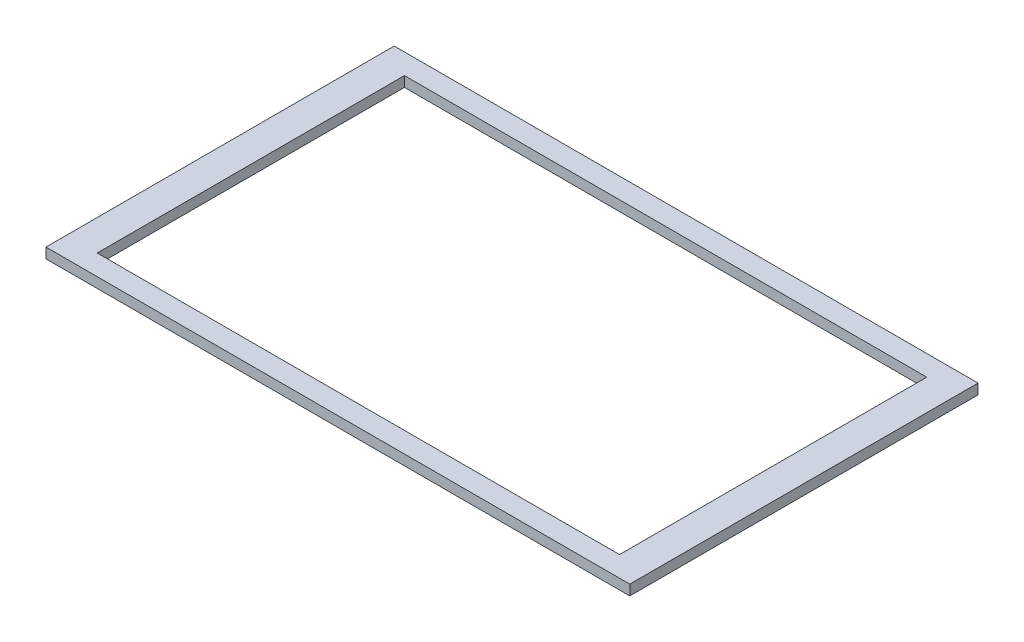
ISO-10303-21;
HEADER;
FILE_DESCRIPTION(('STEP AP214'),'2;1');
FILE_NAME('part.step','',(''),(''),'','','');
FILE_SCHEMA(('AUTOMOTIVE_DESIGN { 1 0 10303 214 1 1 1 1 }'));
ENDSEC;
DATA;
#1=APPLICATION_CONTEXT('core data for automotive mechanical design processes');
#2=APPLICATION_PROTOCOL_DEFINITION('international standard','automotive_design',2000,#1);
#3=PRODUCT_CONTEXT('',#1,'mechanical');
#4=PRODUCT('Part','Part','',(#3));
#5=PRODUCT_RELATED_PRODUCT_CATEGORY('part','',(#4));
#6=PRODUCT_DEFINITION_FORMATION('','',#4);
#7=PRODUCT_DEFINITION_CONTEXT('part definition',#1,'design');
#8=PRODUCT_DEFINITION('design','',#6,#7);
#9=PRODUCT_DEFINITION_SHAPE('','',#8);
#10=(LENGTH_UNIT() NAMED_UNIT(*) SI_UNIT(.MILLI.,.METRE.));
#11=(NAMED_UNIT(*) PLANE_ANGLE_UNIT() SI_UNIT($,.RADIAN.));
#12=(NAMED_UNIT(*) SI_UNIT($,.STERADIAN.) SOLID_ANGLE_UNIT());
#13=UNCERTAINTY_MEASURE_WITH_UNIT(LENGTH_MEASURE(1.E-05),#10,'distance_accuracy_value','');
#14=(GEOMETRIC_REPRESENTATION_CONTEXT(3) GLOBAL_UNCERTAINTY_ASSIGNED_CONTEXT((#13)) GLOBAL_UNIT_ASSIGNED_CONTEXT((#10,
#11,#12)) REPRESENTATION_CONTEXT('',''));
#15=CARTESIAN_POINT('',(0.,0.,0.));
#16=DIRECTION('',(0.,0.,1.));
#17=DIRECTION('',(1.,0.,0.));
#18=AXIS2_PLACEMENT_3D('',#15,#16,#17);
#19=CARTESIAN_POINT('',(285.,10.,-170.));
#20=DIRECTION('',(-1.,0.,0.));
#21=DIRECTION('',(0.,0.,1.));
#22=AXIS2_PLACEMENT_3D('',#19,#20,#21);
#23=PLANE('',#22);
#24=DIRECTION('',(0.,0.,-1.));
#25=VECTOR('',#24,1.);
#26=CARTESIAN_POINT('',(285.,0.,-170.));
#27=LINE('',#26,#25);
#28=CARTESIAN_POINT('',(285.,0.,170.));
#29=VERTEX_POINT('',#28);
#30=CARTESIAN_POINT('',(285.,0.,-170.));
#31=VERTEX_POINT('',#30);
#32=EDGE_CURVE('E147',#29,#31,#27,.T.);
#33=ORIENTED_EDGE('',*,*,#32,.T.);
#34=DIRECTION('',(0.,-1.,0.));
#35=VECTOR('',#34,1.);
#36=CARTESIAN_POINT('',(285.,10.,-170.));
#37=LINE('',#36,#35);
#38=CARTESIAN_POINT('',(285.,10.,-170.));
#39=VERTEX_POINT('',#38);
#40=EDGE_CURVE('E11',#39,#31,#37,.T.);
#41=ORIENTED_EDGE('',*,*,#40,.F.);
#42=DIRECTION('',(0.,0.,-1.));
#43=VECTOR('',#42,1.);
#44=CARTESIAN_POINT('',(285.,10.,-170.));
#45=LINE('',#44,#43);
#46=CARTESIAN_POINT('',(285.,10.,170.));
#47=VERTEX_POINT('',#46);
#48=EDGE_CURVE('E153',#47,#39,#45,.T.);
#49=ORIENTED_EDGE('',*,*,#48,.F.);
#50=DIRECTION('',(0.,-1.,0.));
#51=VECTOR('',#50,1.);
#52=CARTESIAN_POINT('',(285.,10.,170.));
#53=LINE('',#52,#51);
#54=EDGE_CURVE('E167',#47,#29,#53,.T.);
#55=ORIENTED_EDGE('',*,*,#54,.T.);
#56=EDGE_LOOP('',(#33,#41,#49,#55));
#57=FACE_BOUND('',#56,.T.);
#58=ADVANCED_FACE('F39',(#57),#23,.F.);
#59=CARTESIAN_POINT('',(-285.,10.,-170.));
#60=DIRECTION('',(0.,0.,1.));
#61=DIRECTION('',(1.,0.,0.));
#62=AXIS2_PLACEMENT_3D('',#59,#60,#61);
#63=PLANE('',#62);
#64=DIRECTION('',(-1.,0.,0.));
#65=VECTOR('',#64,1.);
#66=CARTESIAN_POINT('',(-285.,0.,-170.));
#67=LINE('',#66,#65);
#68=CARTESIAN_POINT('',(-285.,0.,-170.));
#69=VERTEX_POINT('',#68);
#70=EDGE_CURVE('E171',#31,#69,#67,.T.);
#71=ORIENTED_EDGE('',*,*,#70,.T.);
#72=DIRECTION('',(0.,-1.,0.));
#73=VECTOR('',#72,1.);
#74=CARTESIAN_POINT('',(-285.,10.,-170.));
#75=LINE('',#74,#73);
#76=CARTESIAN_POINT('',(-285.,10.,-170.));
#77=VERTEX_POINT('',#76);
#78=EDGE_CURVE('E47',#77,#69,#75,.T.);
#79=ORIENTED_EDGE('',*,*,#78,.F.);
#80=DIRECTION('',(-1.,0.,0.));
#81=VECTOR('',#80,1.);
#82=CARTESIAN_POINT('',(-285.,10.,-170.));
#83=LINE('',#82,#81);
#84=EDGE_CURVE('E157',#39,#77,#83,.T.);
#85=ORIENTED_EDGE('',*,*,#84,.F.);
#86=ORIENTED_EDGE('',*,*,#40,.T.);
#87=EDGE_LOOP('',(#71,#79,#85,#86));
#88=FACE_BOUND('',#87,.T.);
#89=ADVANCED_FACE('F205',(#88),#63,.F.);
#90=CARTESIAN_POINT('',(-285.,10.,-170.));
#91=DIRECTION('',(1.,0.,0.));
#92=DIRECTION('',(0.,0.,-1.));
#93=AXIS2_PLACEMENT_3D('',#90,#91,#92);
#94=PLANE('',#93);
#95=DIRECTION('',(0.,0.,1.));
#96=VECTOR('',#95,1.);
#97=CARTESIAN_POINT('',(-285.,0.,-170.));
#98=LINE('',#97,#96);
#99=CARTESIAN_POINT('',(-285.,0.,170.));
#100=VERTEX_POINT('',#99);
#101=EDGE_CURVE('E174',#69,#100,#98,.T.);
#102=ORIENTED_EDGE('',*,*,#101,.T.);
#103=DIRECTION('',(0.,-1.,0.));
#104=VECTOR('',#103,1.);
#105=CARTESIAN_POINT('',(-285.,10.,170.));
#106=LINE('',#105,#104);
#107=CARTESIAN_POINT('',(-285.,10.,170.));
#108=VERTEX_POINT('',#107);
#109=EDGE_CURVE('E182',#108,#100,#106,.T.);
#110=ORIENTED_EDGE('',*,*,#109,.F.);
#111=DIRECTION('',(0.,0.,1.));
#112=VECTOR('',#111,1.);
#113=CARTESIAN_POINT('',(-285.,10.,-170.));
#114=LINE('',#113,#112);
#115=EDGE_CURVE('E161',#77,#108,#114,.T.);
#116=ORIENTED_EDGE('',*,*,#115,.F.);
#117=ORIENTED_EDGE('',*,*,#78,.T.);
#118=EDGE_LOOP('',(#102,#110,#116,#117));
#119=FACE_BOUND('',#118,.T.);
#120=ADVANCED_FACE('F191',(#119),#94,.F.);
#121=CARTESIAN_POINT('',(-285.,10.,170.));
#122=DIRECTION('',(0.,0.,-1.));
#123=DIRECTION('',(-1.,0.,0.));
#124=AXIS2_PLACEMENT_3D('',#121,#122,#123);
#125=PLANE('',#124);
#126=DIRECTION('',(1.,0.,0.));
#127=VECTOR('',#126,1.);
#128=CARTESIAN_POINT('',(-285.,0.,170.));
#129=LINE('',#128,#127);
#130=EDGE_CURVE('E158',#100,#29,#129,.T.);
#131=ORIENTED_EDGE('',*,*,#130,.T.);
#132=ORIENTED_EDGE('',*,*,#54,.F.);
#133=DIRECTION('',(1.,0.,0.));
#134=VECTOR('',#133,1.);
#135=CARTESIAN_POINT('',(-285.,10.,170.));
#136=LINE('',#135,#134);
#137=EDGE_CURVE('E164',#108,#47,#136,.T.);
#138=ORIENTED_EDGE('',*,*,#137,.F.);
#139=ORIENTED_EDGE('',*,*,#109,.T.);
#140=EDGE_LOOP('',(#131,#132,#138,#139));
#141=FACE_BOUND('',#140,.T.);
#142=ADVANCED_FACE('F198',(#141),#125,.F.);
#143=CARTESIAN_POINT('',(0.,10.,0.));
#144=DIRECTION('',(0.,1.,0.));
#145=DIRECTION('',(0.,0.,1.));
#146=AXIS2_PLACEMENT_3D('',#143,#144,#145);
#147=PLANE('',#146);
#148=DIRECTION('',(0.,0.,-1.));
#149=VECTOR('',#148,1.);
#150=CARTESIAN_POINT('',(255.,10.,-150.));
#151=LINE('',#150,#149);
#152=CARTESIAN_POINT('',(255.,10.,150.));
#153=VERTEX_POINT('',#152);
#154=CARTESIAN_POINT('',(255.,10.,-150.));
#155=VERTEX_POINT('',#154);
#156=EDGE_CURVE('E54',#153,#155,#151,.T.);
#157=ORIENTED_EDGE('',*,*,#156,.F.);
#158=DIRECTION('',(1.,0.,0.));
#159=VECTOR('',#158,1.);
#160=CARTESIAN_POINT('',(-255.,10.,150.));
#161=LINE('',#160,#159);
#162=CARTESIAN_POINT('',(-255.,10.,150.));
#163=VERTEX_POINT('',#162);
#164=EDGE_CURVE('E125',#163,#153,#161,.T.);
#165=ORIENTED_EDGE('',*,*,#164,.F.);
#166=DIRECTION('',(0.,0.,1.));
#167=VECTOR('',#166,1.);
#168=CARTESIAN_POINT('',(-255.,10.,-150.));
#169=LINE('',#168,#167);
#170=CARTESIAN_POINT('',(-255.,10.,-150.));
#171=VERTEX_POINT('',#170);
#172=EDGE_CURVE('E129',#171,#163,#169,.T.);
#173=ORIENTED_EDGE('',*,*,#172,.F.);
#174=DIRECTION('',(-1.,0.,0.));
#175=VECTOR('',#174,1.);
#176=CARTESIAN_POINT('',(-255.,10.,-150.));
#177=LINE('',#176,#175);
#178=EDGE_CURVE('E138',#155,#171,#177,.T.);
#179=ORIENTED_EDGE('',*,*,#178,.F.);
#180=EDGE_LOOP('',(#157,#165,#173,#179));
#181=FACE_BOUND('',#180,.T.);
#182=ORIENTED_EDGE('',*,*,#48,.T.);
#183=ORIENTED_EDGE('',*,*,#84,.T.);
#184=ORIENTED_EDGE('',*,*,#115,.T.);
#185=ORIENTED_EDGE('',*,*,#137,.T.);
#186=EDGE_LOOP('',(#182,#183,#184,#185));
#187=FACE_BOUND('',#186,.T.);
#188=ADVANCED_FACE('F204',(#181,#187),#147,.T.);
#189=CARTESIAN_POINT('',(0.,0.,0.));
#190=DIRECTION('',(0.,1.,0.));
#191=DIRECTION('',(0.,0.,1.));
#192=AXIS2_PLACEMENT_3D('',#189,#190,#191);
#193=PLANE('',#192);
#194=DIRECTION('',(1.,0.,0.));
#195=VECTOR('',#194,1.);
#196=CARTESIAN_POINT('',(-255.,0.,150.));
#197=LINE('',#196,#195);
#198=CARTESIAN_POINT('',(-255.,0.,150.));
#199=VERTEX_POINT('',#198);
#200=CARTESIAN_POINT('',(255.,0.,150.));
#201=VERTEX_POINT('',#200);
#202=EDGE_CURVE('E113',#199,#201,#197,.T.);
#203=ORIENTED_EDGE('',*,*,#202,.T.);
#204=DIRECTION('',(0.,0.,-1.));
#205=VECTOR('',#204,1.);
#206=CARTESIAN_POINT('',(255.,0.,-150.));
#207=LINE('',#206,#205);
#208=CARTESIAN_POINT('',(255.,0.,-150.));
#209=VERTEX_POINT('',#208);
#210=EDGE_CURVE('E106',#201,#209,#207,.T.);
#211=ORIENTED_EDGE('',*,*,#210,.T.);
#212=DIRECTION('',(-1.,0.,0.));
#213=VECTOR('',#212,1.);
#214=CARTESIAN_POINT('',(-255.,0.,-150.));
#215=LINE('',#214,#213);
#216=CARTESIAN_POINT('',(-255.,0.,-150.));
#217=VERTEX_POINT('',#216);
#218=EDGE_CURVE('E116',#209,#217,#215,.T.);
#219=ORIENTED_EDGE('',*,*,#218,.T.);
#220=DIRECTION('',(0.,0.,1.));
#221=VECTOR('',#220,1.);
#222=CARTESIAN_POINT('',(-255.,0.,-150.));
#223=LINE('',#222,#221);
#224=EDGE_CURVE('E62',#217,#199,#223,.T.);
#225=ORIENTED_EDGE('',*,*,#224,.T.);
#226=EDGE_LOOP('',(#203,#211,#219,#225));
#227=FACE_BOUND('',#226,.T.);
#228=ORIENTED_EDGE('',*,*,#32,.F.);
#229=ORIENTED_EDGE('',*,*,#130,.F.);
#230=ORIENTED_EDGE('',*,*,#101,.F.);
#231=ORIENTED_EDGE('',*,*,#70,.F.);
#232=EDGE_LOOP('',(#228,#229,#230,#231));
#233=FACE_BOUND('',#232,.T.);
#234=ADVANCED_FACE('F121',(#227,#233),#193,.F.);
#235=CARTESIAN_POINT('',(255.,0.,-150.));
#236=DIRECTION('',(1.,0.,0.));
#237=DIRECTION('',(0.,0.,-1.));
#238=AXIS2_PLACEMENT_3D('',#235,#236,#237);
#239=PLANE('',#238);
#240=ORIENTED_EDGE('',*,*,#156,.T.);
#241=DIRECTION('',(0.,1.,0.));
#242=VECTOR('',#241,1.);
#243=CARTESIAN_POINT('',(255.,0.,-150.));
#244=LINE('',#243,#242);
#245=EDGE_CURVE('E102',#209,#155,#244,.T.);
#246=ORIENTED_EDGE('',*,*,#245,.F.);
#247=ORIENTED_EDGE('',*,*,#210,.F.);
#248=DIRECTION('',(0.,1.,0.));
#249=VECTOR('',#248,1.);
#250=CARTESIAN_POINT('',(255.,0.,150.));
#251=LINE('',#250,#249);
#252=EDGE_CURVE('E144',#201,#153,#251,.T.);
#253=ORIENTED_EDGE('',*,*,#252,.T.);
#254=EDGE_LOOP('',(#240,#246,#247,#253));
#255=FACE_BOUND('',#254,.T.);
#256=ADVANCED_FACE('F104',(#255),#239,.F.);
#257=CARTESIAN_POINT('',(-255.,0.,150.));
#258=DIRECTION('',(0.,0.,1.));
#259=DIRECTION('',(1.,0.,0.));
#260=AXIS2_PLACEMENT_3D('',#257,#258,#259);
#261=PLANE('',#260);
#262=ORIENTED_EDGE('',*,*,#164,.T.);
#263=ORIENTED_EDGE('',*,*,#252,.F.);
#264=ORIENTED_EDGE('',*,*,#202,.F.);
#265=DIRECTION('',(0.,1.,0.));
#266=VECTOR('',#265,1.);
#267=CARTESIAN_POINT('',(-255.,0.,150.));
#268=LINE('',#267,#266);
#269=EDGE_CURVE('E148',#199,#163,#268,.T.);
#270=ORIENTED_EDGE('',*,*,#269,.T.);
#271=EDGE_LOOP('',(#262,#263,#264,#270));
#272=FACE_BOUND('',#271,.T.);
#273=ADVANCED_FACE('F222',(#272),#261,.F.);
#274=CARTESIAN_POINT('',(-255.,0.,-150.));
#275=DIRECTION('',(-1.,0.,0.));
#276=DIRECTION('',(0.,0.,1.));
#277=AXIS2_PLACEMENT_3D('',#274,#275,#276);
#278=PLANE('',#277);
#279=ORIENTED_EDGE('',*,*,#172,.T.);
#280=ORIENTED_EDGE('',*,*,#269,.F.);
#281=ORIENTED_EDGE('',*,*,#224,.F.);
#282=DIRECTION('',(0.,1.,0.));
#283=VECTOR('',#282,1.);
#284=CARTESIAN_POINT('',(-255.,0.,-150.));
#285=LINE('',#284,#283);
#286=EDGE_CURVE('E112',#217,#171,#285,.T.);
#287=ORIENTED_EDGE('',*,*,#286,.T.);
#288=EDGE_LOOP('',(#279,#280,#281,#287));
#289=FACE_BOUND('',#288,.T.);
#290=ADVANCED_FACE('F225',(#289),#278,.F.);
#291=CARTESIAN_POINT('',(-255.,0.,-150.));
#292=DIRECTION('',(0.,0.,-1.));
#293=DIRECTION('',(-1.,0.,0.));
#294=AXIS2_PLACEMENT_3D('',#291,#292,#293);
#295=PLANE('',#294);
#296=ORIENTED_EDGE('',*,*,#178,.T.);
#297=ORIENTED_EDGE('',*,*,#286,.F.);
#298=ORIENTED_EDGE('',*,*,#218,.F.);
#299=ORIENTED_EDGE('',*,*,#245,.T.);
#300=EDGE_LOOP('',(#296,#297,#298,#299));
#301=FACE_BOUND('',#300,.T.);
#302=ADVANCED_FACE('F117',(#301),#295,.F.);
#303=CLOSED_SHELL('',(#58,#89,#120,#142,#188,#234,#256,#273,#290,#302));
#304=MANIFOLD_SOLID_BREP('B2',#303);
#305=ADVANCED_BREP_SHAPE_REPRESENTATION('',(#18,#304),#14);
#306=SHAPE_DEFINITION_REPRESENTATION(#9,#305);
ENDSEC;
END-ISO-10303-21;
